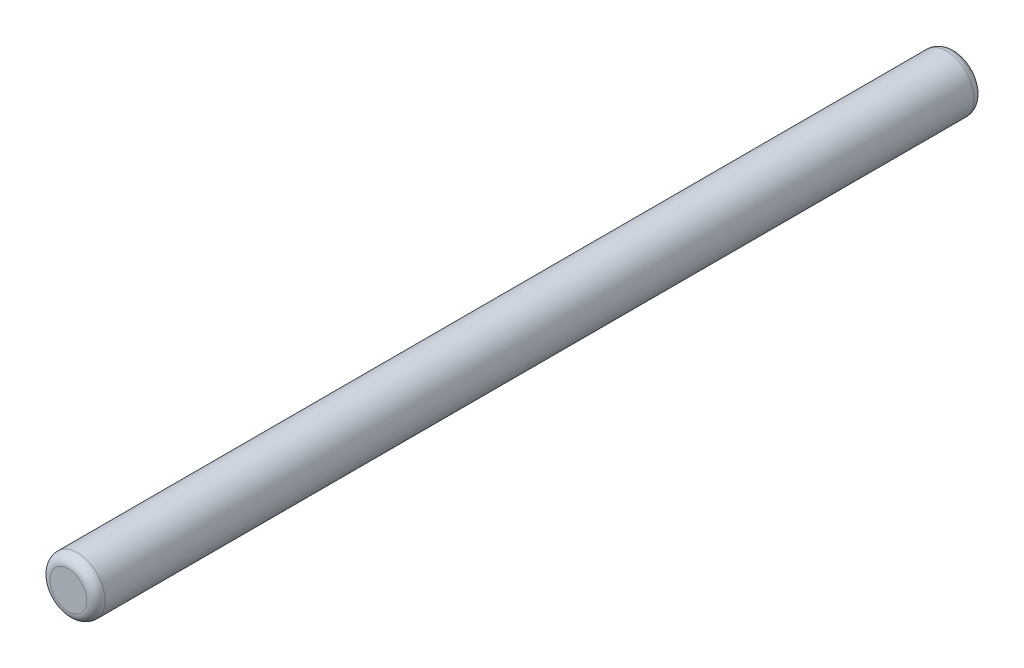
ISO-10303-21;
HEADER;
FILE_DESCRIPTION(('STEP AP214'),'2;1');
FILE_NAME('part.step','',(''),(''),'','','');
FILE_SCHEMA(('AUTOMOTIVE_DESIGN { 1 0 10303 214 1 1 1 1 }'));
ENDSEC;
DATA;
#1=APPLICATION_CONTEXT('core data for automotive mechanical design processes');
#2=APPLICATION_PROTOCOL_DEFINITION('international standard','automotive_design',2000,#1);
#3=PRODUCT_CONTEXT('',#1,'mechanical');
#4=PRODUCT('Part','Part','',(#3));
#5=PRODUCT_RELATED_PRODUCT_CATEGORY('part','',(#4));
#6=PRODUCT_DEFINITION_FORMATION('','',#4);
#7=PRODUCT_DEFINITION_CONTEXT('part definition',#1,'design');
#8=PRODUCT_DEFINITION('design','',#6,#7);
#9=PRODUCT_DEFINITION_SHAPE('','',#8);
#10=(LENGTH_UNIT() NAMED_UNIT(*) SI_UNIT(.MILLI.,.METRE.));
#11=(NAMED_UNIT(*) PLANE_ANGLE_UNIT() SI_UNIT($,.RADIAN.));
#12=(NAMED_UNIT(*) SI_UNIT($,.STERADIAN.) SOLID_ANGLE_UNIT());
#13=UNCERTAINTY_MEASURE_WITH_UNIT(LENGTH_MEASURE(1.E-05),#10,'distance_accuracy_value','');
#14=(GEOMETRIC_REPRESENTATION_CONTEXT(3) GLOBAL_UNCERTAINTY_ASSIGNED_CONTEXT((#13)) GLOBAL_UNIT_ASSIGNED_CONTEXT((#10,
#11,#12)) REPRESENTATION_CONTEXT('',''));
#15=CARTESIAN_POINT('',(0.,0.,0.));
#16=DIRECTION('',(0.,0.,1.));
#17=DIRECTION('',(1.,0.,0.));
#18=AXIS2_PLACEMENT_3D('',#15,#16,#17);
#19=CARTESIAN_POINT('',(0.,0.,48.));
#20=DIRECTION('',(0.,0.,-1.));
#21=DIRECTION('',(-1.,0.,0.));
#22=AXIS2_PLACEMENT_3D('',#19,#20,#21);
#23=CYLINDRICAL_SURFACE('',#22,1.5);
#24=CARTESIAN_POINT('',(0.,0.,0.5));
#25=DIRECTION('',(0.,0.,1.));
#26=DIRECTION('',(1.,0.,0.));
#27=AXIS2_PLACEMENT_3D('',#24,#25,#26);
#28=CIRCLE('',#27,1.5);
#29=CARTESIAN_POINT('',(1.5,0.,0.5));
#30=VERTEX_POINT('',#29);
#31=EDGE_CURVE('E44',#30,#30,#28,.T.);
#32=ORIENTED_EDGE('',*,*,#31,.T.);
#33=EDGE_LOOP('',(#32));
#34=FACE_BOUND('',#33,.T.);
#35=CARTESIAN_POINT('',(0.,0.,47.5));
#36=DIRECTION('',(0.,0.,1.));
#37=DIRECTION('',(1.,0.,0.));
#38=AXIS2_PLACEMENT_3D('',#35,#36,#37);
#39=CIRCLE('',#38,1.5);
#40=CARTESIAN_POINT('',(1.5,0.,47.5));
#41=VERTEX_POINT('',#40);
#42=EDGE_CURVE('E50',#41,#41,#39,.F.);
#43=ORIENTED_EDGE('',*,*,#42,.T.);
#44=EDGE_LOOP('',(#43));
#45=FACE_BOUND('',#44,.T.);
#46=ADVANCED_FACE('F33',(#34,#45),#23,.T.);
#47=CARTESIAN_POINT('',(0.,0.,48.));
#48=DIRECTION('',(0.,0.,1.));
#49=DIRECTION('',(1.,0.,0.));
#50=AXIS2_PLACEMENT_3D('',#47,#48,#49);
#51=PLANE('',#50);
#52=CARTESIAN_POINT('',(0.,0.,48.));
#53=DIRECTION('',(0.,0.,1.));
#54=DIRECTION('',(1.,0.,0.));
#55=AXIS2_PLACEMENT_3D('',#52,#53,#54);
#56=CIRCLE('',#55,1.);
#57=CARTESIAN_POINT('',(1.,0.,48.));
#58=VERTEX_POINT('',#57);
#59=EDGE_CURVE('E10',#58,#58,#56,.T.);
#60=ORIENTED_EDGE('',*,*,#59,.T.);
#61=EDGE_LOOP('',(#60));
#62=FACE_BOUND('',#61,.T.);
#63=ADVANCED_FACE('F69',(#62),#51,.T.);
#64=CARTESIAN_POINT('',(0.,0.,0.));
#65=DIRECTION('',(0.,0.,1.));
#66=DIRECTION('',(1.,0.,0.));
#67=AXIS2_PLACEMENT_3D('',#64,#65,#66);
#68=PLANE('',#67);
#69=CARTESIAN_POINT('',(0.,0.,0.));
#70=DIRECTION('',(0.,0.,1.));
#71=DIRECTION('',(1.,0.,0.));
#72=AXIS2_PLACEMENT_3D('',#69,#70,#71);
#73=CIRCLE('',#72,1.);
#74=CARTESIAN_POINT('',(1.,0.,0.));
#75=VERTEX_POINT('',#74);
#76=EDGE_CURVE('E39',#75,#75,#73,.F.);
#77=ORIENTED_EDGE('',*,*,#76,.T.);
#78=EDGE_LOOP('',(#77));
#79=FACE_BOUND('',#78,.T.);
#80=ADVANCED_FACE('F65',(#79),#68,.F.);
#81=CARTESIAN_POINT('',(0.,0.,0.5));
#82=DIRECTION('',(0.,0.,1.));
#83=DIRECTION('',(1.,0.,0.));
#84=AXIS2_PLACEMENT_3D('',#81,#82,#83);
#85=TOROIDAL_SURFACE('',#84,1.,0.5);
#86=ORIENTED_EDGE('',*,*,#76,.F.);
#87=EDGE_LOOP('',(#86));
#88=FACE_BOUND('',#87,.T.);
#89=ORIENTED_EDGE('',*,*,#31,.F.);
#90=EDGE_LOOP('',(#89));
#91=FACE_BOUND('',#90,.T.);
#92=ADVANCED_FACE('F60',(#88,#91),#85,.T.);
#93=CARTESIAN_POINT('',(0.,0.,47.5));
#94=DIRECTION('',(0.,0.,1.));
#95=DIRECTION('',(1.,0.,0.));
#96=AXIS2_PLACEMENT_3D('',#93,#94,#95);
#97=TOROIDAL_SURFACE('',#96,1.,0.5);
#98=ORIENTED_EDGE('',*,*,#42,.F.);
#99=EDGE_LOOP('',(#98));
#100=FACE_BOUND('',#99,.T.);
#101=ORIENTED_EDGE('',*,*,#59,.F.);
#102=EDGE_LOOP('',(#101));
#103=FACE_BOUND('',#102,.T.);
#104=ADVANCED_FACE('F57',(#100,#103),#97,.T.);
#105=CLOSED_SHELL('',(#46,#63,#80,#92,#104));
#106=MANIFOLD_SOLID_BREP('B2',#105);
#107=ADVANCED_BREP_SHAPE_REPRESENTATION('',(#18,#106),#14);
#108=SHAPE_DEFINITION_REPRESENTATION(#9,#107);
ENDSEC;
END-ISO-10303-21;
